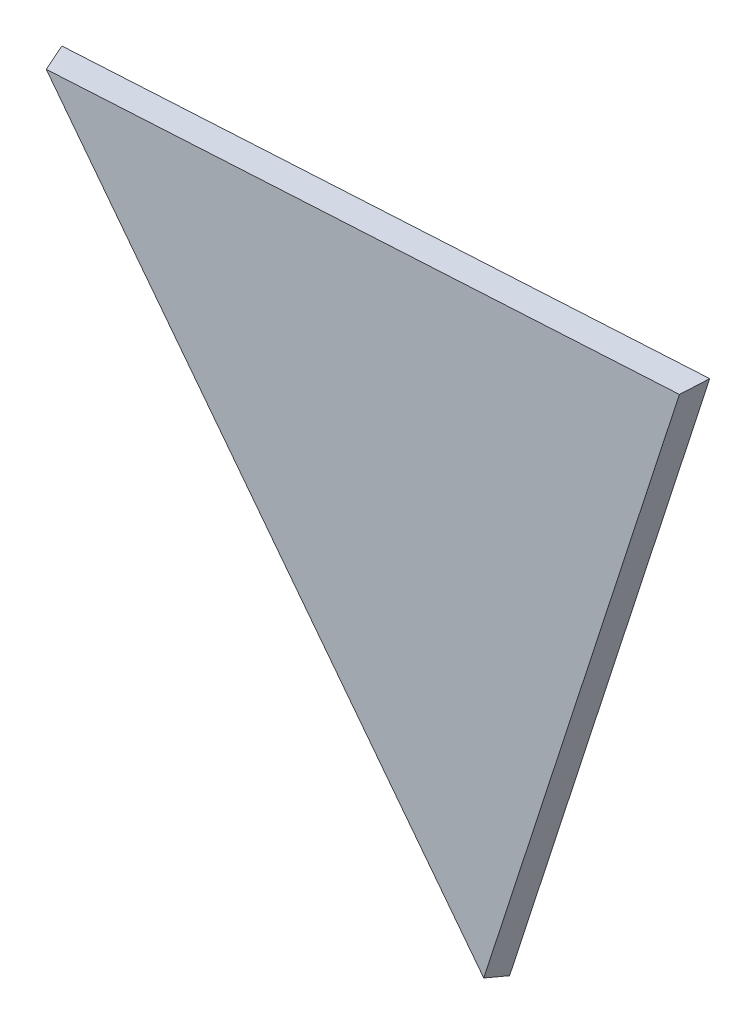
ISO-10303-21;
HEADER;
FILE_DESCRIPTION(('STEP AP214'),'2;1');
FILE_NAME('part.step','',(''),(''),'','','');
FILE_SCHEMA(('AUTOMOTIVE_DESIGN { 1 0 10303 214 1 1 1 1 }'));
ENDSEC;
DATA;
#1=APPLICATION_CONTEXT('core data for automotive mechanical design processes');
#2=APPLICATION_PROTOCOL_DEFINITION('international standard','automotive_design',2000,#1);
#3=PRODUCT_CONTEXT('',#1,'mechanical');
#4=PRODUCT('Part','Part','',(#3));
#5=PRODUCT_RELATED_PRODUCT_CATEGORY('part','',(#4));
#6=PRODUCT_DEFINITION_FORMATION('','',#4);
#7=PRODUCT_DEFINITION_CONTEXT('part definition',#1,'design');
#8=PRODUCT_DEFINITION('design','',#6,#7);
#9=PRODUCT_DEFINITION_SHAPE('','',#8);
#10=(LENGTH_UNIT() NAMED_UNIT(*) SI_UNIT(.MILLI.,.METRE.));
#11=(NAMED_UNIT(*) PLANE_ANGLE_UNIT() SI_UNIT($,.RADIAN.));
#12=(NAMED_UNIT(*) SI_UNIT($,.STERADIAN.) SOLID_ANGLE_UNIT());
#13=UNCERTAINTY_MEASURE_WITH_UNIT(LENGTH_MEASURE(1.E-05),#10,'distance_accuracy_value','');
#14=(GEOMETRIC_REPRESENTATION_CONTEXT(3) GLOBAL_UNCERTAINTY_ASSIGNED_CONTEXT((#13)) GLOBAL_UNIT_ASSIGNED_CONTEXT((#10,
#11,#12)) REPRESENTATION_CONTEXT('',''));
#15=CARTESIAN_POINT('',(0.,0.,0.));
#16=DIRECTION('',(0.,0.,1.));
#17=DIRECTION('',(1.,0.,0.));
#18=AXIS2_PLACEMENT_3D('',#15,#16,#17);
#19=CARTESIAN_POINT('',(0.,0.,60.));
#20=DIRECTION('',(0.,0.,-1.));
#21=DIRECTION('',(-1.,0.,0.));
#22=AXIS2_PLACEMENT_3D('',#19,#20,#21);
#23=PLANE('',#22);
#24=DIRECTION('',(-0.998473286091908,-0.0552367356098018,0.));
#25=VECTOR('',#24,1.);
#26=CARTESIAN_POINT('',(-30.3839066761003,549.22722728409,60.));
#27=LINE('',#26,#25);
#28=CARTESIAN_POINT('',(770.812327015292,593.550360560093,60.));
#29=VERTEX_POINT('',#28);
#30=CARTESIAN_POINT('',(-829.254457708692,505.032753552539,60.));
#31=VERTEX_POINT('',#30);
#32=EDGE_CURVE('E88',#29,#31,#27,.T.);
#33=ORIENTED_EDGE('',*,*,#32,.T.);
#34=DIRECTION('',(0.610109647488099,-0.792316993407277,0.));
#35=VECTOR('',#34,1.);
#36=CARTESIAN_POINT('',(-276.444979653998,-212.87155329238,60.));
#37=LINE('',#36,#35);
#38=CARTESIAN_POINT('',(276.3644984007,-930.775860137303,60.));
#39=VERTEX_POINT('',#38);
#40=EDGE_CURVE('E78',#31,#39,#37,.T.);
#41=ORIENTED_EDGE('',*,*,#40,.T.);
#42=DIRECTION('',(0.308545213831799,0.951209677737506,0.));
#43=VECTOR('',#42,1.);
#44=CARTESIAN_POINT('',(523.22907497545,-169.720547004217,60.));
#45=LINE('',#44,#43);
#46=EDGE_CURVE('E77',#39,#29,#45,.T.);
#47=ORIENTED_EDGE('',*,*,#46,.T.);
#48=EDGE_LOOP('',(#33,#41,#47));
#49=FACE_BOUND('',#48,.T.);
#50=ADVANCED_FACE('F38',(#49),#23,.F.);
#51=CARTESIAN_POINT('',(0.,0.,0.));
#52=DIRECTION('',(0.,0.,-1.));
#53=DIRECTION('',(-1.,0.,0.));
#54=AXIS2_PLACEMENT_3D('',#51,#52,#53);
#55=PLANE('',#54);
#56=DIRECTION('',(0.610109647488099,-0.792316993407277,0.));
#57=VECTOR('',#56,1.);
#58=CARTESIAN_POINT('',(281.615569426732,-953.197537878031,0.));
#59=LINE('',#58,#57);
#60=CARTESIAN_POINT('',(-849.589927608854,515.838957491439,0.));
#61=VERTEX_POINT('',#60);
#62=CARTESIAN_POINT('',(281.615569426732,-953.197537878031,0.));
#63=VERTEX_POINT('',#62);
#64=EDGE_CURVE('E82',#61,#63,#59,.T.);
#65=ORIENTED_EDGE('',*,*,#64,.F.);
#66=DIRECTION('',(-0.998473286091908,-0.0552367356098018,0.));
#67=VECTOR('',#66,1.);
#68=CARTESIAN_POINT('',(-849.589927608854,515.838957491439,0.));
#69=LINE('',#68,#67);
#70=CARTESIAN_POINT('',(787.506047005333,606.405063542784,0.));
#71=VERTEX_POINT('',#70);
#72=EDGE_CURVE('E83',#71,#61,#69,.T.);
#73=ORIENTED_EDGE('',*,*,#72,.F.);
#74=DIRECTION('',(0.308545213831799,0.951209677737506,0.));
#75=VECTOR('',#74,1.);
#76=CARTESIAN_POINT('',(787.506047005333,606.405063542784,0.));
#77=LINE('',#76,#75);
#78=EDGE_CURVE('E76',#63,#71,#77,.T.);
#79=ORIENTED_EDGE('',*,*,#78,.F.);
#80=EDGE_LOOP('',(#65,#73,#79));
#81=FACE_BOUND('',#80,.T.);
#82=ADVANCED_FACE('F81',(#81),#55,.T.);
#83=CARTESIAN_POINT('',(-30.3839066761003,549.22722728409,60.));
#84=DIRECTION('',(0.054179135509839,-0.979355837612682,-0.19474795148953));
#85=DIRECTION('',(-0.998473286091908,-0.0552367356098018,0.));
#86=AXIS2_PLACEMENT_3D('',#83,#84,#85);
#87=PLANE('',#86);
#88=ORIENTED_EDGE('',*,*,#72,.T.);
#89=DIRECTION('',(0.316419420475128,-0.16814427228237,0.933598550794085));
#90=VECTOR('',#89,1.);
#91=CARTESIAN_POINT('',(-751.621867610542,463.779042424922,289.055705560655));
#92=LINE('',#91,#90);
#93=EDGE_CURVE('E11',#61,#31,#92,.T.);
#94=ORIENTED_EDGE('',*,*,#93,.T.);
#95=ORIENTED_EDGE('',*,*,#32,.F.);
#96=DIRECTION('',(0.262513504365558,0.202143867848364,-0.943517099324129));
#97=VECTOR('',#96,1.);
#98=CARTESIAN_POINT('',(713.247189563579,549.223347495242,266.898657049663));
#99=LINE('',#98,#97);
#100=EDGE_CURVE('E91',#29,#71,#99,.T.);
#101=ORIENTED_EDGE('',*,*,#100,.T.);
#102=EDGE_LOOP('',(#88,#94,#95,#101));
#103=FACE_BOUND('',#102,.T.);
#104=ADVANCED_FACE('F94',(#103),#87,.F.);
#105=CARTESIAN_POINT('',(523.22907497545,-169.720547004217,60.));
#106=DIRECTION('',(-0.932997170442229,0.30263759736263,-0.194747951489534));
#107=DIRECTION('',(0.308545213831799,0.951209677737506,0.));
#108=AXIS2_PLACEMENT_3D('',#105,#106,#107);
#109=PLANE('',#108);
#110=ORIENTED_EDGE('',*,*,#46,.F.);
#111=DIRECTION('',(0.0817065383336703,-0.348880764085259,-0.933598550794084));
#112=VECTOR('',#111,1.);
#113=CARTESIAN_POINT('',(256.318035420419,-845.1789732247,289.055705560657));
#114=LINE('',#113,#112);
#115=EDGE_CURVE('E46',#39,#63,#114,.T.);
#116=ORIENTED_EDGE('',*,*,#115,.T.);
#117=ORIENTED_EDGE('',*,*,#78,.T.);
#118=ORIENTED_EDGE('',*,*,#100,.F.);
#119=EDGE_LOOP('',(#110,#116,#117,#118));
#120=FACE_BOUND('',#119,.T.);
#121=ADVANCED_FACE('F74',(#120),#109,.F.);
#122=CARTESIAN_POINT('',(-276.444979653998,-212.87155329238,60.));
#123=DIRECTION('',(0.782529780721693,0.602573177954846,-0.156693035879251));
#124=DIRECTION('',(0.610109647488099,-0.792316993407277,0.));
#125=AXIS2_PLACEMENT_3D('',#122,#123,#124);
#126=PLANE('',#125);
#127=ORIENTED_EDGE('',*,*,#93,.F.);
#128=ORIENTED_EDGE('',*,*,#64,.T.);
#129=ORIENTED_EDGE('',*,*,#115,.F.);
#130=ORIENTED_EDGE('',*,*,#40,.F.);
#131=EDGE_LOOP('',(#127,#128,#129,#130));
#132=FACE_BOUND('',#131,.T.);
#133=ADVANCED_FACE('F40',(#132),#126,.F.);
#134=CLOSED_SHELL('',(#50,#82,#104,#121,#133));
#135=MANIFOLD_SOLID_BREP('B2',#134);
#136=ADVANCED_BREP_SHAPE_REPRESENTATION('',(#18,#135),#14);
#137=SHAPE_DEFINITION_REPRESENTATION(#9,#136);
ENDSEC;
END-ISO-10303-21;
